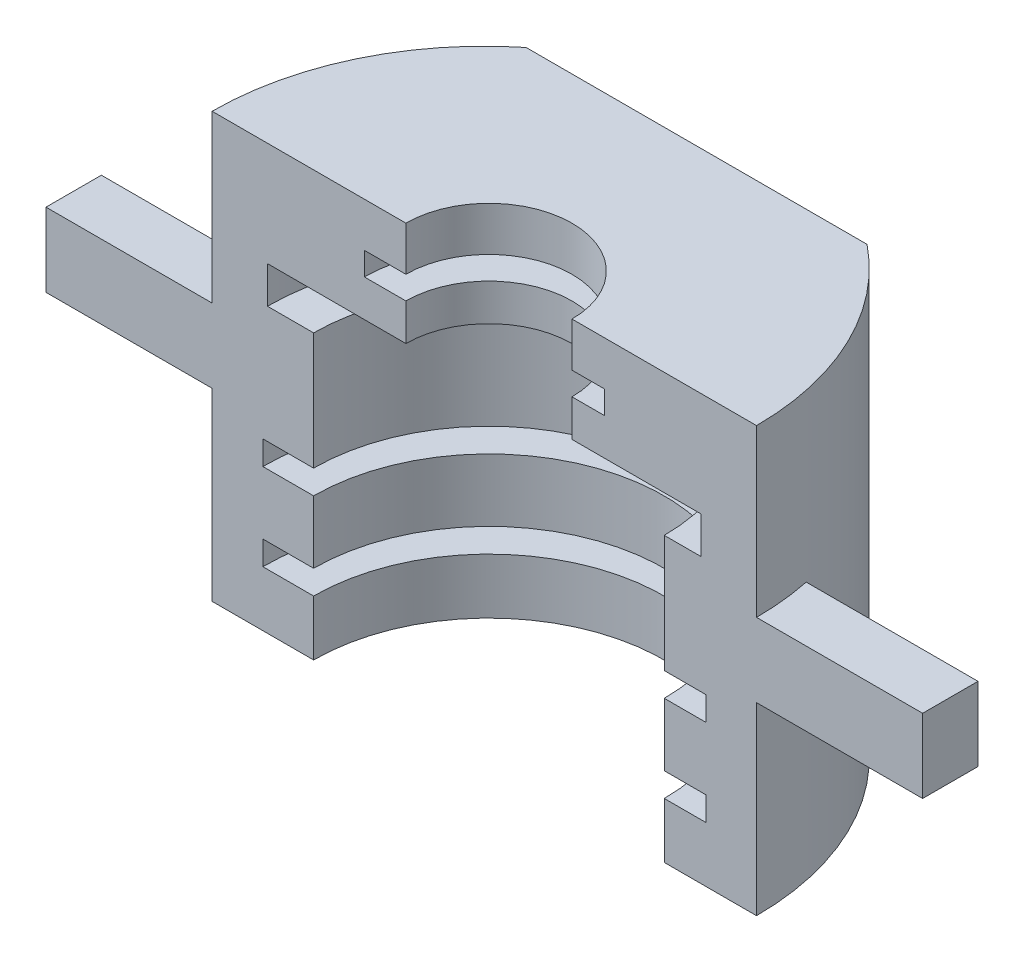
ISO-10303-21;
HEADER;
FILE_DESCRIPTION(('STEP AP214'),'2;1');
FILE_NAME('part.step','',(''),(''),'','','');
FILE_SCHEMA(('AUTOMOTIVE_DESIGN { 1 0 10303 214 1 1 1 1 }'));
ENDSEC;
DATA;
#1=APPLICATION_CONTEXT('core data for automotive mechanical design processes');
#2=APPLICATION_PROTOCOL_DEFINITION('international standard','automotive_design',2000,#1);
#3=PRODUCT_CONTEXT('',#1,'mechanical');
#4=PRODUCT('Part','Part','',(#3));
#5=PRODUCT_RELATED_PRODUCT_CATEGORY('part','',(#4));
#6=PRODUCT_DEFINITION_FORMATION('','',#4);
#7=PRODUCT_DEFINITION_CONTEXT('part definition',#1,'design');
#8=PRODUCT_DEFINITION('design','',#6,#7);
#9=PRODUCT_DEFINITION_SHAPE('','',#8);
#10=(LENGTH_UNIT() NAMED_UNIT(*) SI_UNIT(.MILLI.,.METRE.));
#11=(NAMED_UNIT(*) PLANE_ANGLE_UNIT() SI_UNIT($,.RADIAN.));
#12=(NAMED_UNIT(*) SI_UNIT($,.STERADIAN.) SOLID_ANGLE_UNIT());
#13=UNCERTAINTY_MEASURE_WITH_UNIT(LENGTH_MEASURE(1.E-05),#10,'distance_accuracy_value','');
#14=(GEOMETRIC_REPRESENTATION_CONTEXT(3) GLOBAL_UNCERTAINTY_ASSIGNED_CONTEXT((#13)) GLOBAL_UNIT_ASSIGNED_CONTEXT((#10,
#11,#12)) REPRESENTATION_CONTEXT('',''));
#15=CARTESIAN_POINT('',(0.,0.,0.));
#16=DIRECTION('',(0.,0.,1.));
#17=DIRECTION('',(1.,0.,0.));
#18=AXIS2_PLACEMENT_3D('',#15,#16,#17);
#19=CARTESIAN_POINT('',(-91.3788198560476,17.35,0.));
#20=DIRECTION('',(0.,1.,0.));
#21=DIRECTION('',(0.,0.,1.));
#22=AXIS2_PLACEMENT_3D('',#19,#20,#21);
#23=CYLINDRICAL_SURFACE('',#22,12.);
#24=DIRECTION('',(0.,1.,0.));
#25=VECTOR('',#24,1.);
#26=CARTESIAN_POINT('',(-87.9509925558469,17.35,-11.5));
#27=LINE('',#26,#25);
#28=CARTESIAN_POINT('',(-87.9509925558469,3.00301976420174,-11.5));
#29=VERTEX_POINT('',#28);
#30=CARTESIAN_POINT('',(-87.9509925558469,4.30301976420174,-11.5));
#31=VERTEX_POINT('',#30);
#32=EDGE_CURVE('E351',#29,#31,#27,.T.);
#33=ORIENTED_EDGE('',*,*,#32,.F.);
#34=CARTESIAN_POINT('',(-91.3788198560476,3.00301976420174,0.));
#35=DIRECTION('',(0.,1.,0.));
#36=DIRECTION('',(0.,0.,1.));
#37=AXIS2_PLACEMENT_3D('',#34,#35,#36);
#38=CIRCLE('',#37,12.);
#39=CARTESIAN_POINT('',(-79.3788198560476,3.00301976420174,0.));
#40=VERTEX_POINT('',#39);
#41=EDGE_CURVE('E495',#40,#29,#38,.T.);
#42=ORIENTED_EDGE('',*,*,#41,.F.);
#43=DIRECTION('',(0.,1.,0.));
#44=VECTOR('',#43,1.);
#45=CARTESIAN_POINT('',(-79.3788198560476,3.00301976420174,0.));
#46=LINE('',#45,#44);
#47=CARTESIAN_POINT('',(-79.3788198560476,4.30301976420174,0.));
#48=VERTEX_POINT('',#47);
#49=EDGE_CURVE('E417',#40,#48,#46,.T.);
#50=ORIENTED_EDGE('',*,*,#49,.T.);
#51=CARTESIAN_POINT('',(-91.3788198560476,4.30301976420174,0.));
#52=DIRECTION('',(0.,1.,0.));
#53=DIRECTION('',(0.,0.,1.));
#54=AXIS2_PLACEMENT_3D('',#51,#52,#53);
#55=CIRCLE('',#54,12.);
#56=EDGE_CURVE('E491',#48,#31,#55,.T.);
#57=ORIENTED_EDGE('',*,*,#56,.T.);
#58=EDGE_LOOP('',(#33,#42,#50,#57));
#59=FACE_BOUND('',#58,.T.);
#60=ADVANCED_FACE('F33',(#59),#23,.F.);
#61=CARTESIAN_POINT('',(-91.3788198560476,17.35,0.));
#62=DIRECTION('',(0.,1.,0.));
#63=DIRECTION('',(0.,0.,1.));
#64=AXIS2_PLACEMENT_3D('',#61,#62,#63);
#65=CYLINDRICAL_SURFACE('',#64,12.);
#66=DIRECTION('',(0.,1.,0.));
#67=VECTOR('',#66,1.);
#68=CARTESIAN_POINT('',(-87.9509925558469,17.35,-11.5));
#69=LINE('',#68,#67);
#70=CARTESIAN_POINT('',(-87.9509925558469,7.70301976420174,-11.5));
#71=VERTEX_POINT('',#70);
#72=CARTESIAN_POINT('',(-87.9509925558469,9.00301976420174,-11.5));
#73=VERTEX_POINT('',#72);
#74=EDGE_CURVE('E343',#71,#73,#69,.T.);
#75=ORIENTED_EDGE('',*,*,#74,.F.);
#76=CARTESIAN_POINT('',(-91.3788198560476,7.70301976420174,0.));
#77=DIRECTION('',(0.,1.,0.));
#78=DIRECTION('',(0.,0.,1.));
#79=AXIS2_PLACEMENT_3D('',#76,#77,#78);
#80=CIRCLE('',#79,12.);
#81=CARTESIAN_POINT('',(-79.3788198560476,7.70301976420174,0.));
#82=VERTEX_POINT('',#81);
#83=EDGE_CURVE('E487',#82,#71,#80,.T.);
#84=ORIENTED_EDGE('',*,*,#83,.F.);
#85=DIRECTION('',(0.,1.,0.));
#86=VECTOR('',#85,1.);
#87=CARTESIAN_POINT('',(-79.3788198560476,7.70301976420174,0.));
#88=LINE('',#87,#86);
#89=CARTESIAN_POINT('',(-79.3788198560476,9.00301976420174,0.));
#90=VERTEX_POINT('',#89);
#91=EDGE_CURVE('E425',#82,#90,#88,.T.);
#92=ORIENTED_EDGE('',*,*,#91,.T.);
#93=CARTESIAN_POINT('',(-91.3788198560476,9.00301976420174,0.));
#94=DIRECTION('',(0.,1.,0.));
#95=DIRECTION('',(0.,0.,1.));
#96=AXIS2_PLACEMENT_3D('',#93,#94,#95);
#97=CIRCLE('',#96,12.);
#98=EDGE_CURVE('E483',#90,#73,#97,.T.);
#99=ORIENTED_EDGE('',*,*,#98,.T.);
#100=EDGE_LOOP('',(#75,#84,#92,#99));
#101=FACE_BOUND('',#100,.T.);
#102=ADVANCED_FACE('F617',(#101),#65,.F.);
#103=CARTESIAN_POINT('',(-91.3788198560476,17.35,0.));
#104=DIRECTION('',(0.,1.,0.));
#105=DIRECTION('',(0.,0.,1.));
#106=AXIS2_PLACEMENT_3D('',#103,#104,#105);
#107=CYLINDRICAL_SURFACE('',#106,11.75);
#108=DIRECTION('',(0.,1.,0.));
#109=VECTOR('',#108,1.);
#110=CARTESIAN_POINT('',(-88.9679071657991,17.35,-11.5));
#111=LINE('',#110,#109);
#112=CARTESIAN_POINT('',(-88.9679071657991,15.35,-11.5));
#113=VERTEX_POINT('',#112);
#114=CARTESIAN_POINT('',(-88.9679071657991,17.35,-11.5));
#115=VERTEX_POINT('',#114);
#116=EDGE_CURVE('E335',#113,#115,#111,.T.);
#117=ORIENTED_EDGE('',*,*,#116,.F.);
#118=CARTESIAN_POINT('',(-91.3788198560476,15.35,0.));
#119=DIRECTION('',(0.,1.,0.));
#120=DIRECTION('',(0.,0.,1.));
#121=AXIS2_PLACEMENT_3D('',#118,#119,#120);
#122=CIRCLE('',#121,11.75);
#123=CARTESIAN_POINT('',(-79.6288198560476,15.35,0.));
#124=VERTEX_POINT('',#123);
#125=EDGE_CURVE('E479',#124,#113,#122,.T.);
#126=ORIENTED_EDGE('',*,*,#125,.F.);
#127=DIRECTION('',(0.,1.,0.));
#128=VECTOR('',#127,1.);
#129=CARTESIAN_POINT('',(-79.6288198560476,17.35,0.));
#130=LINE('',#129,#128);
#131=CARTESIAN_POINT('',(-79.6288198560476,17.35,0.));
#132=VERTEX_POINT('',#131);
#133=EDGE_CURVE('E433',#124,#132,#130,.T.);
#134=ORIENTED_EDGE('',*,*,#133,.T.);
#135=CARTESIAN_POINT('',(-91.3788198560476,17.35,0.));
#136=DIRECTION('',(0.,1.,0.));
#137=DIRECTION('',(0.,0.,1.));
#138=AXIS2_PLACEMENT_3D('',#135,#136,#137);
#139=CIRCLE('',#138,11.75);
#140=EDGE_CURVE('E475',#132,#115,#139,.T.);
#141=ORIENTED_EDGE('',*,*,#140,.T.);
#142=EDGE_LOOP('',(#117,#126,#134,#141));
#143=FACE_BOUND('',#142,.T.);
#144=ADVANCED_FACE('F621',(#143),#107,.F.);
#145=CARTESIAN_POINT('',(-91.3788198560476,17.35,0.));
#146=DIRECTION('',(0.,1.,0.));
#147=DIRECTION('',(0.,0.,1.));
#148=AXIS2_PLACEMENT_3D('',#145,#146,#147);
#149=CYLINDRICAL_SURFACE('',#148,14.75);
#150=CARTESIAN_POINT('',(-91.3788198560476,9.99999999999997,0.));
#151=DIRECTION('',(0.,-1.,0.));
#152=DIRECTION('',(1.,0.,0.));
#153=AXIS2_PLACEMENT_3D('',#150,#151,#152);
#154=CIRCLE('',#153,14.75);
#155=CARTESIAN_POINT('',(-76.6288198560476,10.,0.));
#156=VERTEX_POINT('',#155);
#157=CARTESIAN_POINT('',(-76.9371267420114,10.,-3.));
#158=VERTEX_POINT('',#157);
#159=EDGE_CURVE('E273',#156,#158,#154,.F.);
#160=ORIENTED_EDGE('',*,*,#159,.F.);
#161=DIRECTION('',(0.,-1.,0.));
#162=VECTOR('',#161,1.);
#163=CARTESIAN_POINT('',(-76.6288198560476,0.,1.02998699495872E-13));
#164=LINE('',#163,#162);
#165=CARTESIAN_POINT('',(-76.6288198560476,0.,1.02998699495872E-13));
#166=VERTEX_POINT('',#165);
#167=EDGE_CURVE('E455',#156,#166,#164,.T.);
#168=ORIENTED_EDGE('',*,*,#167,.T.);
#169=CARTESIAN_POINT('',(-91.3788198560476,0.,0.));
#170=DIRECTION('',(0.,1.,0.));
#171=DIRECTION('',(0.,0.,1.));
#172=AXIS2_PLACEMENT_3D('',#169,#170,#171);
#173=CIRCLE('',#172,14.75);
#174=CARTESIAN_POINT('',(-82.1423432550919,0.,-11.5));
#175=VERTEX_POINT('',#174);
#176=EDGE_CURVE('E461',#166,#175,#173,.T.);
#177=ORIENTED_EDGE('',*,*,#176,.T.);
#178=DIRECTION('',(0.,1.,0.));
#179=VECTOR('',#178,1.);
#180=CARTESIAN_POINT('',(-82.1423432550919,17.35,-11.5));
#181=LINE('',#180,#179);
#182=CARTESIAN_POINT('',(-82.1423432550919,23.,-11.5));
#183=VERTEX_POINT('',#182);
#184=EDGE_CURVE('E329',#183,#175,#181,.F.);
#185=ORIENTED_EDGE('',*,*,#184,.F.);
#186=CARTESIAN_POINT('',(-91.3788198560476,23.,0.));
#187=DIRECTION('',(0.,1.,0.));
#188=DIRECTION('',(0.,0.,1.));
#189=AXIS2_PLACEMENT_3D('',#186,#187,#188);
#190=CIRCLE('',#189,14.75);
#191=CARTESIAN_POINT('',(-76.6288198560476,23.,1.02998699495872E-13));
#192=VERTEX_POINT('',#191);
#193=EDGE_CURVE('E465',#192,#183,#190,.T.);
#194=ORIENTED_EDGE('',*,*,#193,.F.);
#195=CARTESIAN_POINT('',(-76.6288198560476,14.,1.02998699495872E-13));
#196=VERTEX_POINT('',#195);
#197=EDGE_CURVE('E48',#192,#196,#164,.T.);
#198=ORIENTED_EDGE('',*,*,#197,.T.);
#199=CARTESIAN_POINT('',(-91.3788198560476,14.,0.));
#200=DIRECTION('',(0.,1.,0.));
#201=DIRECTION('',(0.,0.,1.));
#202=AXIS2_PLACEMENT_3D('',#199,#200,#201);
#203=CIRCLE('',#202,14.75);
#204=CARTESIAN_POINT('',(-76.9371267420114,14.,-3.));
#205=VERTEX_POINT('',#204);
#206=EDGE_CURVE('E319',#205,#196,#203,.F.);
#207=ORIENTED_EDGE('',*,*,#206,.F.);
#208=DIRECTION('',(0.,1.,0.));
#209=VECTOR('',#208,1.);
#210=CARTESIAN_POINT('',(-76.9371267420114,17.35,-3.));
#211=LINE('',#210,#209);
#212=EDGE_CURVE('E11',#205,#158,#211,.F.);
#213=ORIENTED_EDGE('',*,*,#212,.T.);
#214=EDGE_LOOP('',(#160,#168,#177,#185,#194,#198,#207,#213));
#215=FACE_BOUND('',#214,.T.);
#216=ADVANCED_FACE('F633',(#215),#149,.T.);
#217=CARTESIAN_POINT('',(-182.757639712095,0.,-6.38094888585797E-13));
#218=DIRECTION('',(0.,0.,-1.));
#219=DIRECTION('',(-1.,0.,0.));
#220=AXIS2_PLACEMENT_3D('',#217,#218,#219);
#221=PLANE('',#220);
#222=DIRECTION('',(0.,-1.,0.));
#223=VECTOR('',#222,1.);
#224=CARTESIAN_POINT('',(-106.128819856048,0.,0.));
#225=LINE('',#224,#223);
#226=CARTESIAN_POINT('',(-106.128819856048,23.,0.));
#227=VERTEX_POINT('',#226);
#228=CARTESIAN_POINT('',(-106.128819856048,14.,0.));
#229=VERTEX_POINT('',#228);
#230=EDGE_CURVE('E409',#227,#229,#225,.T.);
#231=ORIENTED_EDGE('',*,*,#230,.T.);
#232=DIRECTION('',(-1.,0.,0.));
#233=VECTOR('',#232,1.);
#234=CARTESIAN_POINT('',(-105.128819856048,14.,0.));
#235=LINE('',#234,#233);
#236=CARTESIAN_POINT('',(-115.128819856048,14.,0.));
#237=VERTEX_POINT('',#236);
#238=EDGE_CURVE('E299',#229,#237,#235,.T.);
#239=ORIENTED_EDGE('',*,*,#238,.T.);
#240=DIRECTION('',(0.,-1.,0.));
#241=VECTOR('',#240,1.);
#242=CARTESIAN_POINT('',(-115.128819856048,10.,0.));
#243=LINE('',#242,#241);
#244=CARTESIAN_POINT('',(-115.128819856048,10.,0.));
#245=VERTEX_POINT('',#244);
#246=EDGE_CURVE('E312',#237,#245,#243,.T.);
#247=ORIENTED_EDGE('',*,*,#246,.T.);
#248=DIRECTION('',(1.,0.,0.));
#249=VECTOR('',#248,1.);
#250=CARTESIAN_POINT('',(-105.128819856048,10.,0.));
#251=LINE('',#250,#249);
#252=CARTESIAN_POINT('',(-106.128819856048,10.,0.));
#253=VERTEX_POINT('',#252);
#254=EDGE_CURVE('E304',#245,#253,#251,.T.);
#255=ORIENTED_EDGE('',*,*,#254,.T.);
#256=CARTESIAN_POINT('',(-106.128819856048,0.,0.));
#257=VERTEX_POINT('',#256);
#258=EDGE_CURVE('E408',#253,#257,#225,.T.);
#259=ORIENTED_EDGE('',*,*,#258,.T.);
#260=DIRECTION('',(1.,0.,0.));
#261=VECTOR('',#260,1.);
#262=CARTESIAN_POINT('',(-91.6288198560476,0.,0.));
#263=LINE('',#262,#261);
#264=CARTESIAN_POINT('',(-100.628819856048,0.,0.));
#265=VERTEX_POINT('',#264);
#266=EDGE_CURVE('E412',#257,#265,#263,.T.);
#267=ORIENTED_EDGE('',*,*,#266,.T.);
#268=DIRECTION('',(0.,-1.,0.));
#269=VECTOR('',#268,1.);
#270=CARTESIAN_POINT('',(-100.628819856048,17.,0.));
#271=LINE('',#270,#269);
#272=CARTESIAN_POINT('',(-100.628819856048,3.00301976420174,0.));
#273=VERTEX_POINT('',#272);
#274=EDGE_CURVE('E502',#265,#273,#271,.F.);
#275=ORIENTED_EDGE('',*,*,#274,.T.);
#276=DIRECTION('',(-1.,0.,0.));
#277=VECTOR('',#276,1.);
#278=CARTESIAN_POINT('',(-91.6288198560476,3.00301976420174,0.));
#279=LINE('',#278,#277);
#280=CARTESIAN_POINT('',(-103.378819856048,3.00301976420174,0.));
#281=VERTEX_POINT('',#280);
#282=EDGE_CURVE('E381',#273,#281,#279,.T.);
#283=ORIENTED_EDGE('',*,*,#282,.T.);
#284=DIRECTION('',(0.,1.,0.));
#285=VECTOR('',#284,1.);
#286=CARTESIAN_POINT('',(-103.378819856048,3.00301976420174,0.));
#287=LINE('',#286,#285);
#288=CARTESIAN_POINT('',(-103.378819856048,4.30301976420174,0.));
#289=VERTEX_POINT('',#288);
#290=EDGE_CURVE('E384',#281,#289,#287,.T.);
#291=ORIENTED_EDGE('',*,*,#290,.T.);
#292=DIRECTION('',(1.,0.,0.));
#293=VECTOR('',#292,1.);
#294=CARTESIAN_POINT('',(-91.6288198560476,4.30301976420174,0.));
#295=LINE('',#294,#293);
#296=CARTESIAN_POINT('',(-100.628819856048,4.30301976420174,0.));
#297=VERTEX_POINT('',#296);
#298=EDGE_CURVE('E387',#289,#297,#295,.T.);
#299=ORIENTED_EDGE('',*,*,#298,.T.);
#300=CARTESIAN_POINT('',(-100.628819856048,7.70301976420174,0.));
#301=VERTEX_POINT('',#300);
#302=EDGE_CURVE('E501',#297,#301,#271,.F.);
#303=ORIENTED_EDGE('',*,*,#302,.T.);
#304=DIRECTION('',(-1.,0.,0.));
#305=VECTOR('',#304,1.);
#306=CARTESIAN_POINT('',(-91.6288198560476,7.70301976420174,0.));
#307=LINE('',#306,#305);
#308=CARTESIAN_POINT('',(-103.378819856048,7.70301976420174,0.));
#309=VERTEX_POINT('',#308);
#310=EDGE_CURVE('E390',#301,#309,#307,.T.);
#311=ORIENTED_EDGE('',*,*,#310,.T.);
#312=DIRECTION('',(0.,1.,0.));
#313=VECTOR('',#312,1.);
#314=CARTESIAN_POINT('',(-103.378819856048,7.70301976420174,0.));
#315=LINE('',#314,#313);
#316=CARTESIAN_POINT('',(-103.378819856048,9.00301976420174,0.));
#317=VERTEX_POINT('',#316);
#318=EDGE_CURVE('E393',#309,#317,#315,.T.);
#319=ORIENTED_EDGE('',*,*,#318,.T.);
#320=DIRECTION('',(1.,0.,0.));
#321=VECTOR('',#320,1.);
#322=CARTESIAN_POINT('',(-91.6288198560476,9.00301976420174,0.));
#323=LINE('',#322,#321);
#324=CARTESIAN_POINT('',(-100.628819856048,9.00301976420174,0.));
#325=VERTEX_POINT('',#324);
#326=EDGE_CURVE('E396',#317,#325,#323,.T.);
#327=ORIENTED_EDGE('',*,*,#326,.T.);
#328=CARTESIAN_POINT('',(-100.628819856048,15.35,0.));
#329=VERTEX_POINT('',#328);
#330=EDGE_CURVE('E498',#325,#329,#271,.F.);
#331=ORIENTED_EDGE('',*,*,#330,.T.);
#332=DIRECTION('',(-1.,0.,0.));
#333=VECTOR('',#332,1.);
#334=CARTESIAN_POINT('',(-103.128819856048,15.35,0.));
#335=LINE('',#334,#333);
#336=CARTESIAN_POINT('',(-103.128819856048,15.35,0.));
#337=VERTEX_POINT('',#336);
#338=EDGE_CURVE('E399',#329,#337,#335,.T.);
#339=ORIENTED_EDGE('',*,*,#338,.T.);
#340=DIRECTION('',(0.,1.,0.));
#341=VECTOR('',#340,1.);
#342=CARTESIAN_POINT('',(-103.128819856048,17.35,0.));
#343=LINE('',#342,#341);
#344=CARTESIAN_POINT('',(-103.128819856048,17.35,0.));
#345=VERTEX_POINT('',#344);
#346=EDGE_CURVE('E402',#337,#345,#343,.T.);
#347=ORIENTED_EDGE('',*,*,#346,.T.);
#348=DIRECTION('',(-1.,0.,0.));
#349=VECTOR('',#348,1.);
#350=CARTESIAN_POINT('',(-91.3788198560476,17.35,0.));
#351=LINE('',#350,#349);
#352=CARTESIAN_POINT('',(-95.6288198560476,17.35,0.));
#353=VERTEX_POINT('',#352);
#354=EDGE_CURVE('E436',#353,#345,#351,.T.);
#355=ORIENTED_EDGE('',*,*,#354,.F.);
#356=DIRECTION('',(0.,1.,0.));
#357=VECTOR('',#356,1.);
#358=CARTESIAN_POINT('',(-95.6288198560476,17.35,0.));
#359=LINE('',#358,#357);
#360=CARTESIAN_POINT('',(-95.6288198560476,19.35,0.));
#361=VERTEX_POINT('',#360);
#362=EDGE_CURVE('E359',#353,#361,#359,.T.);
#363=ORIENTED_EDGE('',*,*,#362,.T.);
#364=DIRECTION('',(1.,0.,0.));
#365=VECTOR('',#364,1.);
#366=CARTESIAN_POINT('',(-91.3788198560476,19.35,0.));
#367=LINE('',#366,#365);
#368=CARTESIAN_POINT('',(-97.8788198560476,19.35,0.));
#369=VERTEX_POINT('',#368);
#370=EDGE_CURVE('E441',#369,#361,#367,.T.);
#371=ORIENTED_EDGE('',*,*,#370,.F.);
#372=DIRECTION('',(0.,1.,0.));
#373=VECTOR('',#372,1.);
#374=CARTESIAN_POINT('',(-97.8788198560476,19.35,0.));
#375=LINE('',#374,#373);
#376=CARTESIAN_POINT('',(-97.8788198560476,20.6,0.));
#377=VERTEX_POINT('',#376);
#378=EDGE_CURVE('E405',#369,#377,#375,.T.);
#379=ORIENTED_EDGE('',*,*,#378,.T.);
#380=DIRECTION('',(-1.,0.,0.));
#381=VECTOR('',#380,1.);
#382=CARTESIAN_POINT('',(-91.3788198560476,20.6,0.));
#383=LINE('',#382,#381);
#384=CARTESIAN_POINT('',(-95.6288198560476,20.6,0.));
#385=VERTEX_POINT('',#384);
#386=EDGE_CURVE('E447',#385,#377,#383,.T.);
#387=ORIENTED_EDGE('',*,*,#386,.F.);
#388=DIRECTION('',(0.,1.,0.));
#389=VECTOR('',#388,1.);
#390=CARTESIAN_POINT('',(-95.6288198560476,17.35,0.));
#391=LINE('',#390,#389);
#392=CARTESIAN_POINT('',(-95.6288198560476,23.,0.));
#393=VERTEX_POINT('',#392);
#394=EDGE_CURVE('E511',#385,#393,#391,.T.);
#395=ORIENTED_EDGE('',*,*,#394,.T.);
#396=DIRECTION('',(1.,0.,0.));
#397=VECTOR('',#396,1.);
#398=CARTESIAN_POINT('',(-76.6288198560476,23.,1.02998699495872E-13));
#399=LINE('',#398,#397);
#400=EDGE_CURVE('E452',#227,#393,#399,.T.);
#401=ORIENTED_EDGE('',*,*,#400,.F.);
#402=EDGE_LOOP('',(#231,#239,#247,#255,#259,#267,#275,#283,#291,#299,#303,#311,#319,#327,#331,
#339,#347,#355,#363,#371,#379,#387,#395,#401));
#403=FACE_BOUND('',#402,.T.);
#404=ADVANCED_FACE('F534',(#403),#221,.F.);
#405=CARTESIAN_POINT('',(-91.1288198560476,3.00301976420174,0.));
#406=DIRECTION('',(0.,1.,0.));
#407=DIRECTION('',(0.,0.,1.));
#408=AXIS2_PLACEMENT_3D('',#405,#406,#407);
#409=PLANE('',#408);
#410=DIRECTION('',(1.,0.,0.));
#411=VECTOR('',#410,1.);
#412=CARTESIAN_POINT('',(-91.1288198560476,3.00301976420174,-11.5));
#413=LINE('',#412,#411);
#414=CARTESIAN_POINT('',(-94.8066471562482,3.00301976420174,-11.5));
#415=VERTEX_POINT('',#414);
#416=EDGE_CURVE('E353',#415,#29,#413,.T.);
#417=ORIENTED_EDGE('',*,*,#416,.F.);
#418=EDGE_CURVE('E494',#415,#281,#38,.T.);
#419=ORIENTED_EDGE('',*,*,#418,.T.);
#420=ORIENTED_EDGE('',*,*,#282,.F.);
#421=CARTESIAN_POINT('',(-91.1288198560476,3.00301976420174,0.));
#422=DIRECTION('',(0.,1.,0.));
#423=DIRECTION('',(0.,0.,1.));
#424=AXIS2_PLACEMENT_3D('',#421,#422,#423);
#425=CIRCLE('',#424,9.49999999999999);
#426=CARTESIAN_POINT('',(-81.6288198560476,3.00301976420174,0.));
#427=VERTEX_POINT('',#426);
#428=EDGE_CURVE('E379',#427,#273,#425,.T.);
#429=ORIENTED_EDGE('',*,*,#428,.F.);
#430=DIRECTION('',(1.,0.,0.));
#431=VECTOR('',#430,1.);
#432=CARTESIAN_POINT('',(-91.1288198560476,3.00301976420174,0.));
#433=LINE('',#432,#431);
#434=EDGE_CURVE('E415',#427,#40,#433,.T.);
#435=ORIENTED_EDGE('',*,*,#434,.T.);
#436=ORIENTED_EDGE('',*,*,#41,.T.);
#437=EDGE_LOOP('',(#417,#419,#420,#429,#435,#436));
#438=FACE_BOUND('',#437,.T.);
#439=ADVANCED_FACE('F35',(#438),#409,.T.);
#440=DIRECTION('',(0.,1.,0.));
#441=VECTOR('',#440,1.);
#442=CARTESIAN_POINT('',(-94.8066471562482,17.35,-11.5));
#443=LINE('',#442,#441);
#444=CARTESIAN_POINT('',(-94.8066471562482,4.30301976420174,-11.5));
#445=VERTEX_POINT('',#444);
#446=EDGE_CURVE('E349',#445,#415,#443,.F.);
#447=ORIENTED_EDGE('',*,*,#446,.F.);
#448=EDGE_CURVE('E490',#445,#289,#55,.T.);
#449=ORIENTED_EDGE('',*,*,#448,.T.);
#450=ORIENTED_EDGE('',*,*,#290,.F.);
#451=ORIENTED_EDGE('',*,*,#418,.F.);
#452=EDGE_LOOP('',(#447,#449,#450,#451));
#453=FACE_BOUND('',#452,.T.);
#454=ADVANCED_FACE('F576',(#453),#23,.F.);
#455=CARTESIAN_POINT('',(-91.1288198560476,4.30301976420174,0.));
#456=DIRECTION('',(0.,-1.,0.));
#457=DIRECTION('',(0.,0.,-1.));
#458=AXIS2_PLACEMENT_3D('',#455,#456,#457);
#459=PLANE('',#458);
#460=DIRECTION('',(-1.,0.,0.));
#461=VECTOR('',#460,1.);
#462=CARTESIAN_POINT('',(-91.1288198560476,4.30301976420174,-11.5));
#463=LINE('',#462,#461);
#464=EDGE_CURVE('E347',#31,#445,#463,.T.);
#465=ORIENTED_EDGE('',*,*,#464,.F.);
#466=ORIENTED_EDGE('',*,*,#56,.F.);
#467=DIRECTION('',(-1.,0.,0.));
#468=VECTOR('',#467,1.);
#469=CARTESIAN_POINT('',(-91.1288198560476,4.30301976420174,0.));
#470=LINE('',#469,#468);
#471=CARTESIAN_POINT('',(-81.6288198560476,4.30301976420174,0.));
#472=VERTEX_POINT('',#471);
#473=EDGE_CURVE('E420',#48,#472,#470,.T.);
#474=ORIENTED_EDGE('',*,*,#473,.T.);
#475=CARTESIAN_POINT('',(-91.1288198560476,4.30301976420174,0.));
#476=DIRECTION('',(0.,-1.,0.));
#477=DIRECTION('',(0.,0.,-1.));
#478=AXIS2_PLACEMENT_3D('',#475,#476,#477);
#479=CIRCLE('',#478,9.49999999999999);
#480=EDGE_CURVE('E377',#297,#472,#479,.T.);
#481=ORIENTED_EDGE('',*,*,#480,.F.);
#482=ORIENTED_EDGE('',*,*,#298,.F.);
#483=ORIENTED_EDGE('',*,*,#448,.F.);
#484=EDGE_LOOP('',(#465,#466,#474,#481,#482,#483));
#485=FACE_BOUND('',#484,.T.);
#486=ADVANCED_FACE('F571',(#485),#459,.T.);
#487=CARTESIAN_POINT('',(-91.1288198560476,7.70301976420174,0.));
#488=DIRECTION('',(0.,1.,0.));
#489=DIRECTION('',(0.,0.,1.));
#490=AXIS2_PLACEMENT_3D('',#487,#488,#489);
#491=PLANE('',#490);
#492=DIRECTION('',(1.,0.,0.));
#493=VECTOR('',#492,1.);
#494=CARTESIAN_POINT('',(-91.1288198560476,7.70301976420174,-11.5));
#495=LINE('',#494,#493);
#496=CARTESIAN_POINT('',(-94.8066471562482,7.70301976420174,-11.5));
#497=VERTEX_POINT('',#496);
#498=EDGE_CURVE('E345',#497,#71,#495,.T.);
#499=ORIENTED_EDGE('',*,*,#498,.F.);
#500=EDGE_CURVE('E486',#497,#309,#80,.T.);
#501=ORIENTED_EDGE('',*,*,#500,.T.);
#502=ORIENTED_EDGE('',*,*,#310,.F.);
#503=CARTESIAN_POINT('',(-91.1288198560476,7.70301976420174,0.));
#504=DIRECTION('',(0.,1.,0.));
#505=DIRECTION('',(0.,0.,1.));
#506=AXIS2_PLACEMENT_3D('',#503,#504,#505);
#507=CIRCLE('',#506,9.49999999999999);
#508=CARTESIAN_POINT('',(-81.6288198560476,7.70301976420174,0.));
#509=VERTEX_POINT('',#508);
#510=EDGE_CURVE('E375',#509,#301,#507,.T.);
#511=ORIENTED_EDGE('',*,*,#510,.F.);
#512=DIRECTION('',(1.,0.,0.));
#513=VECTOR('',#512,1.);
#514=CARTESIAN_POINT('',(-91.1288198560476,7.70301976420174,0.));
#515=LINE('',#514,#513);
#516=EDGE_CURVE('E423',#509,#82,#515,.T.);
#517=ORIENTED_EDGE('',*,*,#516,.T.);
#518=ORIENTED_EDGE('',*,*,#83,.T.);
#519=EDGE_LOOP('',(#499,#501,#502,#511,#517,#518));
#520=FACE_BOUND('',#519,.T.);
#521=ADVANCED_FACE('F585',(#520),#491,.T.);
#522=DIRECTION('',(0.,1.,0.));
#523=VECTOR('',#522,1.);
#524=CARTESIAN_POINT('',(-94.8066471562482,17.35,-11.5));
#525=LINE('',#524,#523);
#526=CARTESIAN_POINT('',(-94.8066471562482,9.00301976420174,-11.5));
#527=VERTEX_POINT('',#526);
#528=EDGE_CURVE('E341',#527,#497,#525,.F.);
#529=ORIENTED_EDGE('',*,*,#528,.F.);
#530=EDGE_CURVE('E482',#527,#317,#97,.T.);
#531=ORIENTED_EDGE('',*,*,#530,.T.);
#532=ORIENTED_EDGE('',*,*,#318,.F.);
#533=ORIENTED_EDGE('',*,*,#500,.F.);
#534=EDGE_LOOP('',(#529,#531,#532,#533));
#535=FACE_BOUND('',#534,.T.);
#536=ADVANCED_FACE('F590',(#535),#65,.F.);
#537=CARTESIAN_POINT('',(-91.1288198560476,9.00301976420174,0.));
#538=DIRECTION('',(0.,-1.,0.));
#539=DIRECTION('',(0.,0.,-1.));
#540=AXIS2_PLACEMENT_3D('',#537,#538,#539);
#541=PLANE('',#540);
#542=DIRECTION('',(-1.,0.,0.));
#543=VECTOR('',#542,1.);
#544=CARTESIAN_POINT('',(-91.1288198560476,9.00301976420174,-11.5));
#545=LINE('',#544,#543);
#546=EDGE_CURVE('E339',#73,#527,#545,.T.);
#547=ORIENTED_EDGE('',*,*,#546,.F.);
#548=ORIENTED_EDGE('',*,*,#98,.F.);
#549=DIRECTION('',(-1.,0.,0.));
#550=VECTOR('',#549,1.);
#551=CARTESIAN_POINT('',(-91.1288198560476,9.00301976420174,0.));
#552=LINE('',#551,#550);
#553=CARTESIAN_POINT('',(-81.6288198560476,9.00301976420174,0.));
#554=VERTEX_POINT('',#553);
#555=EDGE_CURVE('E428',#90,#554,#552,.T.);
#556=ORIENTED_EDGE('',*,*,#555,.T.);
#557=CARTESIAN_POINT('',(-91.1288198560476,9.00301976420174,0.));
#558=DIRECTION('',(0.,-1.,0.));
#559=DIRECTION('',(0.,0.,-1.));
#560=AXIS2_PLACEMENT_3D('',#557,#558,#559);
#561=CIRCLE('',#560,9.49999999999999);
#562=EDGE_CURVE('E373',#325,#554,#561,.T.);
#563=ORIENTED_EDGE('',*,*,#562,.F.);
#564=ORIENTED_EDGE('',*,*,#326,.F.);
#565=ORIENTED_EDGE('',*,*,#530,.F.);
#566=EDGE_LOOP('',(#547,#548,#556,#563,#564,#565));
#567=FACE_BOUND('',#566,.T.);
#568=ADVANCED_FACE('F596',(#567),#541,.T.);
#569=CARTESIAN_POINT('',(-79.6288198560476,15.35,0.));
#570=DIRECTION('',(0.,1.,0.));
#571=DIRECTION('',(0.,0.,1.));
#572=AXIS2_PLACEMENT_3D('',#569,#570,#571);
#573=PLANE('',#572);
#574=DIRECTION('',(1.,0.,0.));
#575=VECTOR('',#574,1.);
#576=CARTESIAN_POINT('',(-79.6288198560476,15.35,-11.5));
#577=LINE('',#576,#575);
#578=CARTESIAN_POINT('',(-93.789732546296,15.35,-11.5));
#579=VERTEX_POINT('',#578);
#580=EDGE_CURVE('E337',#579,#113,#577,.T.);
#581=ORIENTED_EDGE('',*,*,#580,.F.);
#582=EDGE_CURVE('E478',#579,#337,#122,.T.);
#583=ORIENTED_EDGE('',*,*,#582,.T.);
#584=ORIENTED_EDGE('',*,*,#338,.F.);
#585=CARTESIAN_POINT('',(-91.1288198560476,15.35,0.));
#586=DIRECTION('',(0.,1.,0.));
#587=DIRECTION('',(0.,0.,1.));
#588=AXIS2_PLACEMENT_3D('',#585,#586,#587);
#589=CIRCLE('',#588,9.49999999999999);
#590=CARTESIAN_POINT('',(-81.6288198560476,15.35,0.));
#591=VERTEX_POINT('',#590);
#592=EDGE_CURVE('E371',#591,#329,#589,.T.);
#593=ORIENTED_EDGE('',*,*,#592,.F.);
#594=DIRECTION('',(1.,0.,0.));
#595=VECTOR('',#594,1.);
#596=CARTESIAN_POINT('',(-79.6288198560476,15.35,0.));
#597=LINE('',#596,#595);
#598=EDGE_CURVE('E431',#591,#124,#597,.T.);
#599=ORIENTED_EDGE('',*,*,#598,.T.);
#600=ORIENTED_EDGE('',*,*,#125,.T.);
#601=EDGE_LOOP('',(#581,#583,#584,#593,#599,#600));
#602=FACE_BOUND('',#601,.T.);
#603=ADVANCED_FACE('F670',(#602),#573,.T.);
#604=DIRECTION('',(0.,1.,0.));
#605=VECTOR('',#604,1.);
#606=CARTESIAN_POINT('',(-93.789732546296,17.35,-11.5));
#607=LINE('',#606,#605);
#608=CARTESIAN_POINT('',(-93.789732546296,17.35,-11.5));
#609=VERTEX_POINT('',#608);
#610=EDGE_CURVE('E333',#609,#579,#607,.F.);
#611=ORIENTED_EDGE('',*,*,#610,.F.);
#612=EDGE_CURVE('E474',#609,#345,#139,.T.);
#613=ORIENTED_EDGE('',*,*,#612,.T.);
#614=ORIENTED_EDGE('',*,*,#346,.F.);
#615=ORIENTED_EDGE('',*,*,#582,.F.);
#616=EDGE_LOOP('',(#611,#613,#614,#615));
#617=FACE_BOUND('',#616,.T.);
#618=ADVANCED_FACE('F666',(#617),#107,.F.);
#619=CARTESIAN_POINT('',(-91.3788198560476,17.35,0.));
#620=DIRECTION('',(0.,-1.,0.));
#621=DIRECTION('',(0.,0.,-1.));
#622=AXIS2_PLACEMENT_3D('',#619,#620,#621);
#623=PLANE('',#622);
#624=DIRECTION('',(-1.,0.,0.));
#625=VECTOR('',#624,1.);
#626=CARTESIAN_POINT('',(-91.3788198560476,17.35,-11.5));
#627=LINE('',#626,#625);
#628=EDGE_CURVE('E331',#115,#609,#627,.T.);
#629=ORIENTED_EDGE('',*,*,#628,.F.);
#630=ORIENTED_EDGE('',*,*,#140,.F.);
#631=CARTESIAN_POINT('',(-86.6288198560476,17.35,0.));
#632=VERTEX_POINT('',#631);
#633=EDGE_CURVE('E437',#132,#632,#351,.T.);
#634=ORIENTED_EDGE('',*,*,#633,.T.);
#635=CARTESIAN_POINT('',(-91.1288198560476,17.35,0.));
#636=DIRECTION('',(0.,1.,0.));
#637=DIRECTION('',(0.,0.,1.));
#638=AXIS2_PLACEMENT_3D('',#635,#636,#637);
#639=CIRCLE('',#638,4.5);
#640=EDGE_CURVE('E356',#632,#353,#639,.T.);
#641=ORIENTED_EDGE('',*,*,#640,.T.);
#642=ORIENTED_EDGE('',*,*,#354,.T.);
#643=ORIENTED_EDGE('',*,*,#612,.F.);
#644=EDGE_LOOP('',(#629,#630,#634,#641,#642,#643));
#645=FACE_BOUND('',#644,.T.);
#646=ADVANCED_FACE('F662',(#645),#623,.T.);
#647=CARTESIAN_POINT('',(-91.3788198560476,19.35,0.));
#648=DIRECTION('',(0.,1.,0.));
#649=DIRECTION('',(0.,0.,1.));
#650=AXIS2_PLACEMENT_3D('',#647,#648,#649);
#651=PLANE('',#650);
#652=CARTESIAN_POINT('',(-91.1288198560476,19.35,0.));
#653=DIRECTION('',(0.,1.,0.));
#654=DIRECTION('',(0.,0.,1.));
#655=AXIS2_PLACEMENT_3D('',#652,#653,#654);
#656=CIRCLE('',#655,4.5);
#657=CARTESIAN_POINT('',(-86.6288198560476,19.35,0.));
#658=VERTEX_POINT('',#657);
#659=EDGE_CURVE('E367',#658,#361,#656,.T.);
#660=ORIENTED_EDGE('',*,*,#659,.F.);
#661=CARTESIAN_POINT('',(-84.8788198560476,19.35,0.));
#662=VERTEX_POINT('',#661);
#663=EDGE_CURVE('E440',#658,#662,#367,.T.);
#664=ORIENTED_EDGE('',*,*,#663,.T.);
#665=CARTESIAN_POINT('',(-91.3788198560476,19.35,0.));
#666=DIRECTION('',(0.,1.,0.));
#667=DIRECTION('',(0.,0.,1.));
#668=AXIS2_PLACEMENT_3D('',#665,#666,#667);
#669=CIRCLE('',#668,6.50000000000001);
#670=EDGE_CURVE('E471',#662,#369,#669,.T.);
#671=ORIENTED_EDGE('',*,*,#670,.T.);
#672=ORIENTED_EDGE('',*,*,#370,.T.);
#673=EDGE_LOOP('',(#660,#664,#671,#672));
#674=FACE_BOUND('',#673,.T.);
#675=ADVANCED_FACE('F658',(#674),#651,.T.);
#676=CARTESIAN_POINT('',(-91.3788198560476,17.35,0.));
#677=DIRECTION('',(0.,1.,0.));
#678=DIRECTION('',(0.,0.,1.));
#679=AXIS2_PLACEMENT_3D('',#676,#677,#678);
#680=CYLINDRICAL_SURFACE('',#679,6.50000000000001);
#681=CARTESIAN_POINT('',(-91.3788198560476,20.6,0.));
#682=DIRECTION('',(0.,1.,0.));
#683=DIRECTION('',(0.,0.,1.));
#684=AXIS2_PLACEMENT_3D('',#681,#682,#683);
#685=CIRCLE('',#684,6.50000000000001);
#686=CARTESIAN_POINT('',(-84.8788198560476,20.6,0.));
#687=VERTEX_POINT('',#686);
#688=EDGE_CURVE('E468',#687,#377,#685,.T.);
#689=ORIENTED_EDGE('',*,*,#688,.T.);
#690=ORIENTED_EDGE('',*,*,#378,.F.);
#691=ORIENTED_EDGE('',*,*,#670,.F.);
#692=DIRECTION('',(0.,1.,0.));
#693=VECTOR('',#692,1.);
#694=CARTESIAN_POINT('',(-84.8788198560476,19.35,0.));
#695=LINE('',#694,#693);
#696=EDGE_CURVE('E444',#662,#687,#695,.T.);
#697=ORIENTED_EDGE('',*,*,#696,.T.);
#698=EDGE_LOOP('',(#689,#690,#691,#697));
#699=FACE_BOUND('',#698,.T.);
#700=ADVANCED_FACE('F654',(#699),#680,.F.);
#701=CARTESIAN_POINT('',(-91.3788198560476,20.6,0.));
#702=DIRECTION('',(0.,-1.,0.));
#703=DIRECTION('',(0.,0.,-1.));
#704=AXIS2_PLACEMENT_3D('',#701,#702,#703);
#705=PLANE('',#704);
#706=CARTESIAN_POINT('',(-91.1288198560476,20.6,0.));
#707=DIRECTION('',(0.,-1.,0.));
#708=DIRECTION('',(0.,0.,-1.));
#709=AXIS2_PLACEMENT_3D('',#706,#707,#708);
#710=CIRCLE('',#709,4.5);
#711=CARTESIAN_POINT('',(-86.6288198560476,20.6,0.));
#712=VERTEX_POINT('',#711);
#713=EDGE_CURVE('E363',#385,#712,#710,.T.);
#714=ORIENTED_EDGE('',*,*,#713,.F.);
#715=ORIENTED_EDGE('',*,*,#386,.T.);
#716=ORIENTED_EDGE('',*,*,#688,.F.);
#717=EDGE_CURVE('E448',#687,#712,#383,.T.);
#718=ORIENTED_EDGE('',*,*,#717,.T.);
#719=EDGE_LOOP('',(#714,#715,#716,#718));
#720=FACE_BOUND('',#719,.T.);
#721=ADVANCED_FACE('F650',(#720),#705,.T.);
#722=CARTESIAN_POINT('',(-76.6288198560476,23.,1.02998699495872E-13));
#723=DIRECTION('',(0.,1.,0.));
#724=DIRECTION('',(0.,0.,1.));
#725=AXIS2_PLACEMENT_3D('',#722,#723,#724);
#726=PLANE('',#725);
#727=DIRECTION('',(-1.,0.,0.));
#728=VECTOR('',#727,1.);
#729=CARTESIAN_POINT('',(-81.4751204486797,23.,-11.5));
#730=LINE('',#729,#728);
#731=CARTESIAN_POINT('',(-100.615296457003,23.,-11.5));
#732=VERTEX_POINT('',#731);
#733=EDGE_CURVE('E324',#183,#732,#730,.T.);
#734=ORIENTED_EDGE('',*,*,#733,.T.);
#735=EDGE_CURVE('E464',#732,#227,#190,.T.);
#736=ORIENTED_EDGE('',*,*,#735,.T.);
#737=ORIENTED_EDGE('',*,*,#400,.T.);
#738=CARTESIAN_POINT('',(-91.1288198560476,23.,0.));
#739=DIRECTION('',(0.,1.,0.));
#740=DIRECTION('',(0.,0.,1.));
#741=AXIS2_PLACEMENT_3D('',#738,#739,#740);
#742=CIRCLE('',#741,4.5);
#743=CARTESIAN_POINT('',(-86.6288198560476,23.,0.));
#744=VERTEX_POINT('',#743);
#745=EDGE_CURVE('E355',#744,#393,#742,.T.);
#746=ORIENTED_EDGE('',*,*,#745,.F.);
#747=EDGE_CURVE('E451',#744,#192,#399,.T.);
#748=ORIENTED_EDGE('',*,*,#747,.T.);
#749=ORIENTED_EDGE('',*,*,#193,.T.);
#750=EDGE_LOOP('',(#734,#736,#737,#746,#748,#749));
#751=FACE_BOUND('',#750,.T.);
#752=ADVANCED_FACE('F646',(#751),#726,.T.);
#753=CARTESIAN_POINT('',(-91.3788198560476,14.,0.));
#754=DIRECTION('',(0.,1.,0.));
#755=DIRECTION('',(0.,0.,1.));
#756=AXIS2_PLACEMENT_3D('',#753,#754,#755);
#757=CIRCLE('',#756,14.75);
#758=CARTESIAN_POINT('',(-105.820512970084,14.,-3.));
#759=VERTEX_POINT('',#758);
#760=EDGE_CURVE('E41',#229,#759,#757,.F.);
#761=ORIENTED_EDGE('',*,*,#760,.F.);
#762=ORIENTED_EDGE('',*,*,#230,.F.);
#763=ORIENTED_EDGE('',*,*,#735,.F.);
#764=DIRECTION('',(0.,1.,0.));
#765=VECTOR('',#764,1.);
#766=CARTESIAN_POINT('',(-100.615296457003,17.35,-11.5));
#767=LINE('',#766,#765);
#768=CARTESIAN_POINT('',(-100.615296457003,0.,-11.5));
#769=VERTEX_POINT('',#768);
#770=EDGE_CURVE('E327',#769,#732,#767,.T.);
#771=ORIENTED_EDGE('',*,*,#770,.F.);
#772=EDGE_CURVE('E460',#769,#257,#173,.T.);
#773=ORIENTED_EDGE('',*,*,#772,.T.);
#774=ORIENTED_EDGE('',*,*,#258,.F.);
#775=CARTESIAN_POINT('',(-91.3788198560476,10.,0.));
#776=DIRECTION('',(0.,-1.,0.));
#777=DIRECTION('',(0.,0.,-1.));
#778=AXIS2_PLACEMENT_3D('',#775,#776,#777);
#779=CIRCLE('',#778,14.75);
#780=CARTESIAN_POINT('',(-105.820512970084,10.,-3.));
#781=VERTEX_POINT('',#780);
#782=EDGE_CURVE('E517',#781,#253,#779,.F.);
#783=ORIENTED_EDGE('',*,*,#782,.F.);
#784=DIRECTION('',(0.,1.,0.));
#785=VECTOR('',#784,1.);
#786=CARTESIAN_POINT('',(-105.820512970084,17.35,-3.));
#787=LINE('',#786,#785);
#788=EDGE_CURVE('E56',#759,#781,#787,.F.);
#789=ORIENTED_EDGE('',*,*,#788,.F.);
#790=EDGE_LOOP('',(#761,#762,#763,#771,#773,#774,#783,#789));
#791=FACE_BOUND('',#790,.T.);
#792=ADVANCED_FACE('F537',(#791),#149,.T.);
#793=CARTESIAN_POINT('',(-91.1288198560476,0.,0.));
#794=DIRECTION('',(0.,-1.,0.));
#795=DIRECTION('',(0.,0.,-1.));
#796=AXIS2_PLACEMENT_3D('',#793,#794,#795);
#797=PLANE('',#796);
#798=DIRECTION('',(-1.,0.,0.));
#799=VECTOR('',#798,1.);
#800=CARTESIAN_POINT('',(-91.1288198560476,0.,-11.5));
#801=LINE('',#800,#799);
#802=EDGE_CURVE('E514',#175,#769,#801,.T.);
#803=ORIENTED_EDGE('',*,*,#802,.F.);
#804=ORIENTED_EDGE('',*,*,#176,.F.);
#805=DIRECTION('',(-1.,0.,0.));
#806=VECTOR('',#805,1.);
#807=CARTESIAN_POINT('',(-91.1288198560476,0.,0.));
#808=LINE('',#807,#806);
#809=CARTESIAN_POINT('',(-81.6288198560476,0.,0.));
#810=VERTEX_POINT('',#809);
#811=EDGE_CURVE('E457',#166,#810,#808,.T.);
#812=ORIENTED_EDGE('',*,*,#811,.T.);
#813=CARTESIAN_POINT('',(-91.1288198560476,0.,0.));
#814=DIRECTION('',(0.,-1.,0.));
#815=DIRECTION('',(0.,0.,-1.));
#816=AXIS2_PLACEMENT_3D('',#813,#814,#815);
#817=CIRCLE('',#816,9.49999999999999);
#818=EDGE_CURVE('E369',#265,#810,#817,.T.);
#819=ORIENTED_EDGE('',*,*,#818,.F.);
#820=ORIENTED_EDGE('',*,*,#266,.F.);
#821=ORIENTED_EDGE('',*,*,#772,.F.);
#822=EDGE_LOOP('',(#803,#804,#812,#819,#820,#821));
#823=FACE_BOUND('',#822,.T.);
#824=ADVANCED_FACE('F547',(#823),#797,.T.);
#825=ORIENTED_EDGE('',*,*,#167,.F.);
#826=DIRECTION('',(1.,0.,0.));
#827=VECTOR('',#826,1.);
#828=CARTESIAN_POINT('',(-77.6288198560476,10.,0.));
#829=LINE('',#828,#827);
#830=CARTESIAN_POINT('',(-67.6288198560476,10.,0.));
#831=VERTEX_POINT('',#830);
#832=EDGE_CURVE('E294',#156,#831,#829,.T.);
#833=ORIENTED_EDGE('',*,*,#832,.T.);
#834=DIRECTION('',(0.,1.,0.));
#835=VECTOR('',#834,1.);
#836=CARTESIAN_POINT('',(-67.6288198560476,10.,0.));
#837=LINE('',#836,#835);
#838=CARTESIAN_POINT('',(-67.6288198560476,14.,0.));
#839=VERTEX_POINT('',#838);
#840=EDGE_CURVE('E285',#831,#839,#837,.T.);
#841=ORIENTED_EDGE('',*,*,#840,.T.);
#842=DIRECTION('',(-1.,0.,0.));
#843=VECTOR('',#842,1.);
#844=CARTESIAN_POINT('',(-77.6288198560476,14.,0.));
#845=LINE('',#844,#843);
#846=EDGE_CURVE('E278',#839,#196,#845,.T.);
#847=ORIENTED_EDGE('',*,*,#846,.T.);
#848=ORIENTED_EDGE('',*,*,#197,.F.);
#849=ORIENTED_EDGE('',*,*,#747,.F.);
#850=DIRECTION('',(0.,1.,0.));
#851=VECTOR('',#850,1.);
#852=CARTESIAN_POINT('',(-86.6288198560476,17.35,0.));
#853=LINE('',#852,#851);
#854=EDGE_CURVE('E508',#744,#712,#853,.F.);
#855=ORIENTED_EDGE('',*,*,#854,.T.);
#856=ORIENTED_EDGE('',*,*,#717,.F.);
#857=ORIENTED_EDGE('',*,*,#696,.F.);
#858=ORIENTED_EDGE('',*,*,#663,.F.);
#859=DIRECTION('',(0.,1.,0.));
#860=VECTOR('',#859,1.);
#861=CARTESIAN_POINT('',(-86.6288198560476,17.35,0.));
#862=LINE('',#861,#860);
#863=EDGE_CURVE('E361',#632,#658,#862,.T.);
#864=ORIENTED_EDGE('',*,*,#863,.F.);
#865=ORIENTED_EDGE('',*,*,#633,.F.);
#866=ORIENTED_EDGE('',*,*,#133,.F.);
#867=ORIENTED_EDGE('',*,*,#598,.F.);
#868=DIRECTION('',(0.,-1.,0.));
#869=VECTOR('',#868,1.);
#870=CARTESIAN_POINT('',(-81.6288198560476,17.,0.));
#871=LINE('',#870,#869);
#872=EDGE_CURVE('E507',#591,#554,#871,.T.);
#873=ORIENTED_EDGE('',*,*,#872,.T.);
#874=ORIENTED_EDGE('',*,*,#555,.F.);
#875=ORIENTED_EDGE('',*,*,#91,.F.);
#876=ORIENTED_EDGE('',*,*,#516,.F.);
#877=EDGE_CURVE('E506',#509,#472,#871,.T.);
#878=ORIENTED_EDGE('',*,*,#877,.T.);
#879=ORIENTED_EDGE('',*,*,#473,.F.);
#880=ORIENTED_EDGE('',*,*,#49,.F.);
#881=ORIENTED_EDGE('',*,*,#434,.F.);
#882=EDGE_CURVE('E503',#427,#810,#871,.T.);
#883=ORIENTED_EDGE('',*,*,#882,.T.);
#884=ORIENTED_EDGE('',*,*,#811,.F.);
#885=EDGE_LOOP('',(#825,#833,#841,#847,#848,#849,#855,#856,#857,#858,#864,#865,#866,#867,#873,
#874,#875,#876,#878,#879,#880,#881,#883,#884));
#886=FACE_BOUND('',#885,.T.);
#887=ADVANCED_FACE('F556',(#886),#221,.F.);
#888=CARTESIAN_POINT('',(-91.1288198560476,17.,0.));
#889=DIRECTION('',(0.,-1.,0.));
#890=DIRECTION('',(0.,0.,-1.));
#891=AXIS2_PLACEMENT_3D('',#888,#889,#890);
#892=CYLINDRICAL_SURFACE('',#891,9.49999999999999);
#893=ORIENTED_EDGE('',*,*,#562,.T.);
#894=ORIENTED_EDGE('',*,*,#872,.F.);
#895=ORIENTED_EDGE('',*,*,#592,.T.);
#896=ORIENTED_EDGE('',*,*,#330,.F.);
#897=EDGE_LOOP('',(#893,#894,#895,#896));
#898=FACE_BOUND('',#897,.T.);
#899=ADVANCED_FACE('F600',(#898),#892,.F.);
#900=ORIENTED_EDGE('',*,*,#480,.T.);
#901=ORIENTED_EDGE('',*,*,#877,.F.);
#902=ORIENTED_EDGE('',*,*,#510,.T.);
#903=ORIENTED_EDGE('',*,*,#302,.F.);
#904=EDGE_LOOP('',(#900,#901,#902,#903));
#905=FACE_BOUND('',#904,.T.);
#906=ADVANCED_FACE('F606',(#905),#892,.F.);
#907=ORIENTED_EDGE('',*,*,#428,.T.);
#908=ORIENTED_EDGE('',*,*,#274,.F.);
#909=ORIENTED_EDGE('',*,*,#818,.T.);
#910=ORIENTED_EDGE('',*,*,#882,.F.);
#911=EDGE_LOOP('',(#907,#908,#909,#910));
#912=FACE_BOUND('',#911,.T.);
#913=ADVANCED_FACE('F551',(#912),#892,.F.);
#914=CARTESIAN_POINT('',(-91.1288198560476,17.35,0.));
#915=DIRECTION('',(0.,1.,0.));
#916=DIRECTION('',(0.,0.,1.));
#917=AXIS2_PLACEMENT_3D('',#914,#915,#916);
#918=CYLINDRICAL_SURFACE('',#917,4.5);
#919=ORIENTED_EDGE('',*,*,#659,.T.);
#920=ORIENTED_EDGE('',*,*,#362,.F.);
#921=ORIENTED_EDGE('',*,*,#640,.F.);
#922=ORIENTED_EDGE('',*,*,#863,.T.);
#923=EDGE_LOOP('',(#919,#920,#921,#922));
#924=FACE_BOUND('',#923,.T.);
#925=ADVANCED_FACE('F613',(#924),#918,.F.);
#926=ORIENTED_EDGE('',*,*,#713,.T.);
#927=ORIENTED_EDGE('',*,*,#854,.F.);
#928=ORIENTED_EDGE('',*,*,#745,.T.);
#929=ORIENTED_EDGE('',*,*,#394,.F.);
#930=EDGE_LOOP('',(#926,#927,#928,#929));
#931=FACE_BOUND('',#930,.T.);
#932=ADVANCED_FACE('F807',(#931),#918,.F.);
#933=CARTESIAN_POINT('',(-81.4751204486797,23.,-11.5));
#934=DIRECTION('',(0.,0.,1.));
#935=DIRECTION('',(1.,0.,0.));
#936=AXIS2_PLACEMENT_3D('',#933,#934,#935);
#937=PLANE('',#936);
#938=ORIENTED_EDGE('',*,*,#416,.T.);
#939=ORIENTED_EDGE('',*,*,#32,.T.);
#940=ORIENTED_EDGE('',*,*,#464,.T.);
#941=ORIENTED_EDGE('',*,*,#446,.T.);
#942=EDGE_LOOP('',(#938,#939,#940,#941));
#943=FACE_BOUND('',#942,.T.);
#944=ORIENTED_EDGE('',*,*,#498,.T.);
#945=ORIENTED_EDGE('',*,*,#74,.T.);
#946=ORIENTED_EDGE('',*,*,#546,.T.);
#947=ORIENTED_EDGE('',*,*,#528,.T.);
#948=EDGE_LOOP('',(#944,#945,#946,#947));
#949=FACE_BOUND('',#948,.T.);
#950=ORIENTED_EDGE('',*,*,#580,.T.);
#951=ORIENTED_EDGE('',*,*,#116,.T.);
#952=ORIENTED_EDGE('',*,*,#628,.T.);
#953=ORIENTED_EDGE('',*,*,#610,.T.);
#954=EDGE_LOOP('',(#950,#951,#952,#953));
#955=FACE_BOUND('',#954,.T.);
#956=ORIENTED_EDGE('',*,*,#184,.T.);
#957=ORIENTED_EDGE('',*,*,#802,.T.);
#958=ORIENTED_EDGE('',*,*,#770,.T.);
#959=ORIENTED_EDGE('',*,*,#733,.F.);
#960=EDGE_LOOP('',(#956,#957,#958,#959));
#961=FACE_BOUND('',#960,.T.);
#962=ADVANCED_FACE('F566',(#943,#949,#955,#961),#937,.F.);
#963=CARTESIAN_POINT('',(-105.128819856048,10.,-3.));
#964=DIRECTION('',(0.,-1.,0.));
#965=DIRECTION('',(1.,0.,0.));
#966=AXIS2_PLACEMENT_3D('',#963,#964,#965);
#967=PLANE('',#966);
#968=DIRECTION('',(1.,0.,0.));
#969=VECTOR('',#968,1.);
#970=CARTESIAN_POINT('',(-105.128819856048,10.,-3.));
#971=LINE('',#970,#969);
#972=CARTESIAN_POINT('',(-115.128819856048,10.,-3.));
#973=VERTEX_POINT('',#972);
#974=EDGE_CURVE('E307',#973,#781,#971,.T.);
#975=ORIENTED_EDGE('',*,*,#974,.T.);
#976=ORIENTED_EDGE('',*,*,#782,.T.);
#977=ORIENTED_EDGE('',*,*,#254,.F.);
#978=DIRECTION('',(0.,0.,1.));
#979=VECTOR('',#978,1.);
#980=CARTESIAN_POINT('',(-115.128819856048,10.,-3.));
#981=LINE('',#980,#979);
#982=EDGE_CURVE('E317',#973,#245,#981,.T.);
#983=ORIENTED_EDGE('',*,*,#982,.F.);
#984=EDGE_LOOP('',(#975,#976,#977,#983));
#985=FACE_BOUND('',#984,.T.);
#986=ADVANCED_FACE('F536',(#985),#967,.T.);
#987=CARTESIAN_POINT('',(-115.128819856048,10.,-3.));
#988=DIRECTION('',(-1.,0.,0.));
#989=DIRECTION('',(0.,0.,1.));
#990=AXIS2_PLACEMENT_3D('',#987,#988,#989);
#991=PLANE('',#990);
#992=ORIENTED_EDGE('',*,*,#246,.F.);
#993=DIRECTION('',(0.,0.,1.));
#994=VECTOR('',#993,1.);
#995=CARTESIAN_POINT('',(-115.128819856048,14.,-3.));
#996=LINE('',#995,#994);
#997=CARTESIAN_POINT('',(-115.128819856048,14.,-3.));
#998=VERTEX_POINT('',#997);
#999=EDGE_CURVE('E310',#998,#237,#996,.T.);
#1000=ORIENTED_EDGE('',*,*,#999,.F.);
#1001=DIRECTION('',(0.,-1.,0.));
#1002=VECTOR('',#1001,1.);
#1003=CARTESIAN_POINT('',(-115.128819856048,10.,-3.));
#1004=LINE('',#1003,#1002);
#1005=EDGE_CURVE('E303',#998,#973,#1004,.T.);
#1006=ORIENTED_EDGE('',*,*,#1005,.T.);
#1007=ORIENTED_EDGE('',*,*,#982,.T.);
#1008=EDGE_LOOP('',(#992,#1000,#1006,#1007));
#1009=FACE_BOUND('',#1008,.T.);
#1010=ADVANCED_FACE('F531',(#1009),#991,.T.);
#1011=CARTESIAN_POINT('',(-105.128819856048,14.,-3.));
#1012=DIRECTION('',(0.,1.,0.));
#1013=DIRECTION('',(-1.,0.,0.));
#1014=AXIS2_PLACEMENT_3D('',#1011,#1012,#1013);
#1015=PLANE('',#1014);
#1016=ORIENTED_EDGE('',*,*,#238,.F.);
#1017=ORIENTED_EDGE('',*,*,#760,.T.);
#1018=DIRECTION('',(-1.,0.,0.));
#1019=VECTOR('',#1018,1.);
#1020=CARTESIAN_POINT('',(-105.128819856048,14.,-3.));
#1021=LINE('',#1020,#1019);
#1022=EDGE_CURVE('E301',#759,#998,#1021,.T.);
#1023=ORIENTED_EDGE('',*,*,#1022,.T.);
#1024=ORIENTED_EDGE('',*,*,#999,.T.);
#1025=EDGE_LOOP('',(#1016,#1017,#1023,#1024));
#1026=FACE_BOUND('',#1025,.T.);
#1027=ADVANCED_FACE('F522',(#1026),#1015,.T.);
#1028=CARTESIAN_POINT('',(0.,0.,-3.));
#1029=DIRECTION('',(0.,0.,1.));
#1030=DIRECTION('',(1.,0.,0.));
#1031=AXIS2_PLACEMENT_3D('',#1028,#1029,#1030);
#1032=PLANE('',#1031);
#1033=ORIENTED_EDGE('',*,*,#788,.T.);
#1034=ORIENTED_EDGE('',*,*,#974,.F.);
#1035=ORIENTED_EDGE('',*,*,#1005,.F.);
#1036=ORIENTED_EDGE('',*,*,#1022,.F.);
#1037=EDGE_LOOP('',(#1033,#1034,#1035,#1036));
#1038=FACE_BOUND('',#1037,.T.);
#1039=ADVANCED_FACE('F527',(#1038),#1032,.F.);
#1040=CARTESIAN_POINT('',(-77.6288198560476,14.,-3.));
#1041=DIRECTION('',(0.,1.,0.));
#1042=DIRECTION('',(0.,0.,1.));
#1043=AXIS2_PLACEMENT_3D('',#1040,#1041,#1042);
#1044=PLANE('',#1043);
#1045=DIRECTION('',(-1.,0.,0.));
#1046=VECTOR('',#1045,1.);
#1047=CARTESIAN_POINT('',(-77.6288198560476,14.,-3.));
#1048=LINE('',#1047,#1046);
#1049=CARTESIAN_POINT('',(-67.6288198560476,14.,-3.));
#1050=VERTEX_POINT('',#1049);
#1051=EDGE_CURVE('E287',#1050,#205,#1048,.T.);
#1052=ORIENTED_EDGE('',*,*,#1051,.T.);
#1053=ORIENTED_EDGE('',*,*,#206,.T.);
#1054=ORIENTED_EDGE('',*,*,#846,.F.);
#1055=DIRECTION('',(0.,0.,1.));
#1056=VECTOR('',#1055,1.);
#1057=CARTESIAN_POINT('',(-67.6288198560476,14.,-3.));
#1058=LINE('',#1057,#1056);
#1059=EDGE_CURVE('E286',#1050,#839,#1058,.T.);
#1060=ORIENTED_EDGE('',*,*,#1059,.F.);
#1061=EDGE_LOOP('',(#1052,#1053,#1054,#1060));
#1062=FACE_BOUND('',#1061,.T.);
#1063=ADVANCED_FACE('F769',(#1062),#1044,.T.);
#1064=CARTESIAN_POINT('',(-67.6288198560476,10.,-3.));
#1065=DIRECTION('',(1.,0.,0.));
#1066=DIRECTION('',(0.,0.,-1.));
#1067=AXIS2_PLACEMENT_3D('',#1064,#1065,#1066);
#1068=PLANE('',#1067);
#1069=ORIENTED_EDGE('',*,*,#840,.F.);
#1070=DIRECTION('',(0.,0.,1.));
#1071=VECTOR('',#1070,1.);
#1072=CARTESIAN_POINT('',(-67.6288198560476,10.,-3.));
#1073=LINE('',#1072,#1071);
#1074=CARTESIAN_POINT('',(-67.6288198560476,10.,-3.));
#1075=VERTEX_POINT('',#1074);
#1076=EDGE_CURVE('E271',#1075,#831,#1073,.T.);
#1077=ORIENTED_EDGE('',*,*,#1076,.F.);
#1078=DIRECTION('',(0.,1.,0.));
#1079=VECTOR('',#1078,1.);
#1080=CARTESIAN_POINT('',(-67.6288198560476,10.,-3.));
#1081=LINE('',#1080,#1079);
#1082=EDGE_CURVE('E277',#1075,#1050,#1081,.T.);
#1083=ORIENTED_EDGE('',*,*,#1082,.T.);
#1084=ORIENTED_EDGE('',*,*,#1059,.T.);
#1085=EDGE_LOOP('',(#1069,#1077,#1083,#1084));
#1086=FACE_BOUND('',#1085,.T.);
#1087=ADVANCED_FACE('F282',(#1086),#1068,.T.);
#1088=CARTESIAN_POINT('',(-77.6288198560476,10.,-3.));
#1089=DIRECTION('',(0.,-1.,0.));
#1090=DIRECTION('',(0.,0.,-1.));
#1091=AXIS2_PLACEMENT_3D('',#1088,#1089,#1090);
#1092=PLANE('',#1091);
#1093=ORIENTED_EDGE('',*,*,#832,.F.);
#1094=ORIENTED_EDGE('',*,*,#159,.T.);
#1095=DIRECTION('',(1.,0.,0.));
#1096=VECTOR('',#1095,1.);
#1097=CARTESIAN_POINT('',(-77.6288198560476,10.,-3.));
#1098=LINE('',#1097,#1096);
#1099=EDGE_CURVE('E267',#158,#1075,#1098,.T.);
#1100=ORIENTED_EDGE('',*,*,#1099,.T.);
#1101=ORIENTED_EDGE('',*,*,#1076,.T.);
#1102=EDGE_LOOP('',(#1093,#1094,#1100,#1101));
#1103=FACE_BOUND('',#1102,.T.);
#1104=ADVANCED_FACE('F270',(#1103),#1092,.T.);
#1105=CARTESIAN_POINT('',(0.,0.,-3.));
#1106=DIRECTION('',(0.,0.,-1.));
#1107=DIRECTION('',(-1.,0.,0.));
#1108=AXIS2_PLACEMENT_3D('',#1105,#1106,#1107);
#1109=PLANE('',#1108);
#1110=ORIENTED_EDGE('',*,*,#1099,.F.);
#1111=ORIENTED_EDGE('',*,*,#212,.F.);
#1112=ORIENTED_EDGE('',*,*,#1051,.F.);
#1113=ORIENTED_EDGE('',*,*,#1082,.F.);
#1114=EDGE_LOOP('',(#1110,#1111,#1112,#1113));
#1115=FACE_BOUND('',#1114,.T.);
#1116=ADVANCED_FACE('F289',(#1115),#1109,.T.);
#1117=CLOSED_SHELL('',(#60,#102,#144,#216,#404,#439,#454,#486,#521,#536,#568,#603,#618,#646,
#675,#700,#721,#752,#792,#824,#887,#899,#906,#913,#925,#932,#962,#986,#1010,#1027,#1039,#1063,
#1087,#1104,#1116));
#1118=MANIFOLD_SOLID_BREP('B2',#1117);
#1119=ADVANCED_BREP_SHAPE_REPRESENTATION('',(#18,#1118),#14);
#1120=SHAPE_DEFINITION_REPRESENTATION(#9,#1119);
ENDSEC;
END-ISO-10303-21;
